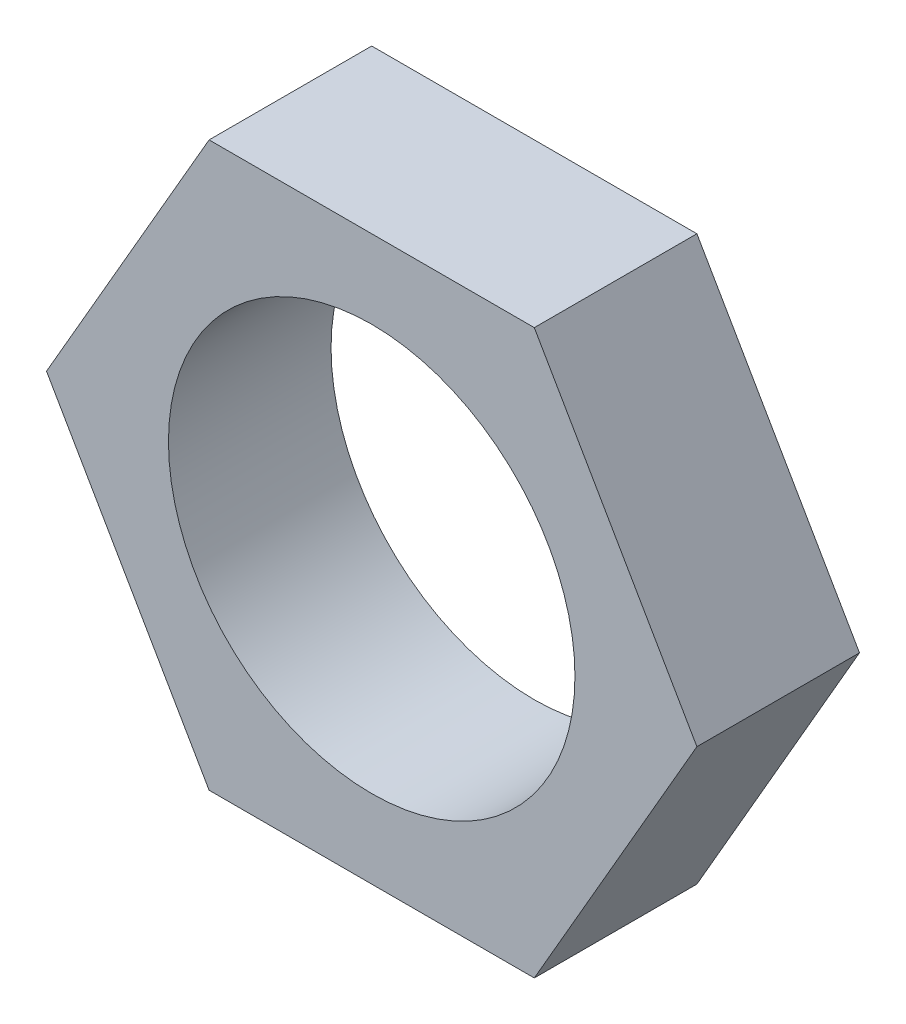
ISO-10303-21;
HEADER;
FILE_DESCRIPTION(('STEP AP214'),'2;1');
FILE_NAME('part.step','',(''),(''),'','','');
FILE_SCHEMA(('AUTOMOTIVE_DESIGN { 1 0 10303 214 1 1 1 1 }'));
ENDSEC;
DATA;
#1=APPLICATION_CONTEXT('core data for automotive mechanical design processes');
#2=APPLICATION_PROTOCOL_DEFINITION('international standard','automotive_design',2000,#1);
#3=PRODUCT_CONTEXT('',#1,'mechanical');
#4=PRODUCT('Part','Part','',(#3));
#5=PRODUCT_RELATED_PRODUCT_CATEGORY('part','',(#4));
#6=PRODUCT_DEFINITION_FORMATION('','',#4);
#7=PRODUCT_DEFINITION_CONTEXT('part definition',#1,'design');
#8=PRODUCT_DEFINITION('design','',#6,#7);
#9=PRODUCT_DEFINITION_SHAPE('','',#8);
#10=(LENGTH_UNIT() NAMED_UNIT(*) SI_UNIT(.MILLI.,.METRE.));
#11=(NAMED_UNIT(*) PLANE_ANGLE_UNIT() SI_UNIT($,.RADIAN.));
#12=(NAMED_UNIT(*) SI_UNIT($,.STERADIAN.) SOLID_ANGLE_UNIT());
#13=UNCERTAINTY_MEASURE_WITH_UNIT(LENGTH_MEASURE(1.E-05),#10,'distance_accuracy_value','');
#14=(GEOMETRIC_REPRESENTATION_CONTEXT(3) GLOBAL_UNCERTAINTY_ASSIGNED_CONTEXT((#13)) GLOBAL_UNIT_ASSIGNED_CONTEXT((#10,
#11,#12)) REPRESENTATION_CONTEXT('',''));
#15=CARTESIAN_POINT('',(0.,0.,0.));
#16=DIRECTION('',(0.,0.,1.));
#17=DIRECTION('',(1.,0.,0.));
#18=AXIS2_PLACEMENT_3D('',#15,#16,#17);
#19=CARTESIAN_POINT('',(0.,0.,2.));
#20=DIRECTION('',(0.,0.,1.));
#21=DIRECTION('',(1.,0.,0.));
#22=AXIS2_PLACEMENT_3D('',#19,#20,#21);
#23=PLANE('',#22);
#24=DIRECTION('',(0.5,0.866025403784439,0.));
#25=VECTOR('',#24,1.);
#26=CARTESIAN_POINT('',(2.,-3.46410161513775,2.));
#27=LINE('',#26,#25);
#28=CARTESIAN_POINT('',(2.,-3.46410161513775,2.));
#29=VERTEX_POINT('',#28);
#30=CARTESIAN_POINT('',(4.,0.,2.));
#31=VERTEX_POINT('',#30);
#32=EDGE_CURVE('E135',#29,#31,#27,.T.);
#33=ORIENTED_EDGE('',*,*,#32,.T.);
#34=DIRECTION('',(-0.5,0.866025403784439,0.));
#35=VECTOR('',#34,1.);
#36=CARTESIAN_POINT('',(4.,0.,2.));
#37=LINE('',#36,#35);
#38=CARTESIAN_POINT('',(2.,3.46410161513775,2.));
#39=VERTEX_POINT('',#38);
#40=EDGE_CURVE('E93',#31,#39,#37,.T.);
#41=ORIENTED_EDGE('',*,*,#40,.T.);
#42=DIRECTION('',(-1.,0.,0.));
#43=VECTOR('',#42,1.);
#44=CARTESIAN_POINT('',(2.,3.46410161513775,2.));
#45=LINE('',#44,#43);
#46=CARTESIAN_POINT('',(-2.,3.46410161513775,2.));
#47=VERTEX_POINT('',#46);
#48=EDGE_CURVE('E106',#39,#47,#45,.T.);
#49=ORIENTED_EDGE('',*,*,#48,.T.);
#50=DIRECTION('',(-0.5,-0.866025403784439,0.));
#51=VECTOR('',#50,1.);
#52=CARTESIAN_POINT('',(-2.,3.46410161513775,2.));
#53=LINE('',#52,#51);
#54=CARTESIAN_POINT('',(-4.,0.,2.));
#55=VERTEX_POINT('',#54);
#56=EDGE_CURVE('E100',#47,#55,#53,.T.);
#57=ORIENTED_EDGE('',*,*,#56,.T.);
#58=DIRECTION('',(0.5,-0.866025403784439,0.));
#59=VECTOR('',#58,1.);
#60=CARTESIAN_POINT('',(-4.,0.,2.));
#61=LINE('',#60,#59);
#62=CARTESIAN_POINT('',(-2.,-3.46410161513775,2.));
#63=VERTEX_POINT('',#62);
#64=EDGE_CURVE('E104',#55,#63,#61,.T.);
#65=ORIENTED_EDGE('',*,*,#64,.T.);
#66=DIRECTION('',(1.,0.,0.));
#67=VECTOR('',#66,1.);
#68=CARTESIAN_POINT('',(-2.,-3.46410161513775,2.));
#69=LINE('',#68,#67);
#70=EDGE_CURVE('E56',#63,#29,#69,.T.);
#71=ORIENTED_EDGE('',*,*,#70,.T.);
#72=EDGE_LOOP('',(#33,#41,#49,#57,#65,#71));
#73=FACE_BOUND('',#72,.T.);
#74=CARTESIAN_POINT('',(0.,0.,2.));
#75=DIRECTION('',(0.,0.,1.));
#76=DIRECTION('',(1.,0.,0.));
#77=AXIS2_PLACEMENT_3D('',#74,#75,#76);
#78=CIRCLE('',#77,2.5);
#79=CARTESIAN_POINT('',(2.5,0.,2.));
#80=VERTEX_POINT('',#79);
#81=EDGE_CURVE('E128',#80,#80,#78,.T.);
#82=ORIENTED_EDGE('',*,*,#81,.F.);
#83=EDGE_LOOP('',(#82));
#84=FACE_BOUND('',#83,.T.);
#85=ADVANCED_FACE('F39',(#73,#84),#23,.T.);
#86=CARTESIAN_POINT('',(0.,0.,0.));
#87=DIRECTION('',(0.,0.,1.));
#88=DIRECTION('',(1.,0.,0.));
#89=AXIS2_PLACEMENT_3D('',#86,#87,#88);
#90=PLANE('',#89);
#91=DIRECTION('',(0.5,0.866025403784439,0.));
#92=VECTOR('',#91,1.);
#93=CARTESIAN_POINT('',(2.,-3.46410161513775,0.));
#94=LINE('',#93,#92);
#95=CARTESIAN_POINT('',(2.,-3.46410161513775,0.));
#96=VERTEX_POINT('',#95);
#97=CARTESIAN_POINT('',(4.,0.,0.));
#98=VERTEX_POINT('',#97);
#99=EDGE_CURVE('E124',#96,#98,#94,.T.);
#100=ORIENTED_EDGE('',*,*,#99,.F.);
#101=DIRECTION('',(1.,0.,0.));
#102=VECTOR('',#101,1.);
#103=CARTESIAN_POINT('',(-2.,-3.46410161513775,0.));
#104=LINE('',#103,#102);
#105=CARTESIAN_POINT('',(-2.,-3.46410161513775,0.));
#106=VERTEX_POINT('',#105);
#107=EDGE_CURVE('E85',#106,#96,#104,.T.);
#108=ORIENTED_EDGE('',*,*,#107,.F.);
#109=DIRECTION('',(0.5,-0.866025403784439,0.));
#110=VECTOR('',#109,1.);
#111=CARTESIAN_POINT('',(-4.,0.,0.));
#112=LINE('',#111,#110);
#113=CARTESIAN_POINT('',(-4.,0.,0.));
#114=VERTEX_POINT('',#113);
#115=EDGE_CURVE('E79',#114,#106,#112,.T.);
#116=ORIENTED_EDGE('',*,*,#115,.F.);
#117=DIRECTION('',(-0.5,-0.866025403784439,0.));
#118=VECTOR('',#117,1.);
#119=CARTESIAN_POINT('',(-2.,3.46410161513775,0.));
#120=LINE('',#119,#118);
#121=CARTESIAN_POINT('',(-2.,3.46410161513775,0.));
#122=VERTEX_POINT('',#121);
#123=EDGE_CURVE('E114',#122,#114,#120,.T.);
#124=ORIENTED_EDGE('',*,*,#123,.F.);
#125=DIRECTION('',(-1.,0.,0.));
#126=VECTOR('',#125,1.);
#127=CARTESIAN_POINT('',(2.,3.46410161513775,0.));
#128=LINE('',#127,#126);
#129=CARTESIAN_POINT('',(2.,3.46410161513775,0.));
#130=VERTEX_POINT('',#129);
#131=EDGE_CURVE('E130',#130,#122,#128,.T.);
#132=ORIENTED_EDGE('',*,*,#131,.F.);
#133=DIRECTION('',(-0.5,0.866025403784439,0.));
#134=VECTOR('',#133,1.);
#135=CARTESIAN_POINT('',(4.,0.,0.));
#136=LINE('',#135,#134);
#137=EDGE_CURVE('E127',#98,#130,#136,.T.);
#138=ORIENTED_EDGE('',*,*,#137,.F.);
#139=EDGE_LOOP('',(#100,#108,#116,#124,#132,#138));
#140=FACE_BOUND('',#139,.T.);
#141=CARTESIAN_POINT('',(0.,0.,0.));
#142=DIRECTION('',(0.,0.,1.));
#143=DIRECTION('',(1.,0.,0.));
#144=AXIS2_PLACEMENT_3D('',#141,#142,#143);
#145=CIRCLE('',#144,2.5);
#146=CARTESIAN_POINT('',(2.5,0.,0.));
#147=VERTEX_POINT('',#146);
#148=EDGE_CURVE('E230',#147,#147,#145,.T.);
#149=ORIENTED_EDGE('',*,*,#148,.T.);
#150=EDGE_LOOP('',(#149));
#151=FACE_BOUND('',#150,.T.);
#152=ADVANCED_FACE('F144',(#140,#151),#90,.F.);
#153=CARTESIAN_POINT('',(2.,-3.46410161513775,2.));
#154=DIRECTION('',(-0.866025403784439,0.5,0.));
#155=DIRECTION('',(-0.5,-0.866025403784439,0.));
#156=AXIS2_PLACEMENT_3D('',#153,#154,#155);
#157=PLANE('',#156);
#158=ORIENTED_EDGE('',*,*,#99,.T.);
#159=DIRECTION('',(0.,0.,-1.));
#160=VECTOR('',#159,1.);
#161=CARTESIAN_POINT('',(4.,0.,2.));
#162=LINE('',#161,#160);
#163=EDGE_CURVE('E11',#31,#98,#162,.T.);
#164=ORIENTED_EDGE('',*,*,#163,.F.);
#165=ORIENTED_EDGE('',*,*,#32,.F.);
#166=DIRECTION('',(0.,0.,-1.));
#167=VECTOR('',#166,1.);
#168=CARTESIAN_POINT('',(2.,-3.46410161513775,2.));
#169=LINE('',#168,#167);
#170=EDGE_CURVE('E120',#29,#96,#169,.T.);
#171=ORIENTED_EDGE('',*,*,#170,.T.);
#172=EDGE_LOOP('',(#158,#164,#165,#171));
#173=FACE_BOUND('',#172,.T.);
#174=ADVANCED_FACE('F41',(#173),#157,.F.);
#175=CARTESIAN_POINT('',(4.,0.,2.));
#176=DIRECTION('',(-0.866025403784439,-0.5,0.));
#177=DIRECTION('',(0.5,-0.866025403784439,0.));
#178=AXIS2_PLACEMENT_3D('',#175,#176,#177);
#179=PLANE('',#178);
#180=ORIENTED_EDGE('',*,*,#137,.T.);
#181=DIRECTION('',(0.,0.,-1.));
#182=VECTOR('',#181,1.);
#183=CARTESIAN_POINT('',(2.,3.46410161513775,2.));
#184=LINE('',#183,#182);
#185=EDGE_CURVE('E48',#39,#130,#184,.T.);
#186=ORIENTED_EDGE('',*,*,#185,.F.);
#187=ORIENTED_EDGE('',*,*,#40,.F.);
#188=ORIENTED_EDGE('',*,*,#163,.T.);
#189=EDGE_LOOP('',(#180,#186,#187,#188));
#190=FACE_BOUND('',#189,.T.);
#191=ADVANCED_FACE('F169',(#190),#179,.F.);
#192=CARTESIAN_POINT('',(2.,3.46410161513775,2.));
#193=DIRECTION('',(0.,-1.,0.));
#194=DIRECTION('',(1.,0.,0.));
#195=AXIS2_PLACEMENT_3D('',#192,#193,#194);
#196=PLANE('',#195);
#197=ORIENTED_EDGE('',*,*,#131,.T.);
#198=DIRECTION('',(0.,0.,-1.));
#199=VECTOR('',#198,1.);
#200=CARTESIAN_POINT('',(-2.,3.46410161513775,2.));
#201=LINE('',#200,#199);
#202=EDGE_CURVE('E115',#47,#122,#201,.T.);
#203=ORIENTED_EDGE('',*,*,#202,.F.);
#204=ORIENTED_EDGE('',*,*,#48,.F.);
#205=ORIENTED_EDGE('',*,*,#185,.T.);
#206=EDGE_LOOP('',(#197,#203,#204,#205));
#207=FACE_BOUND('',#206,.T.);
#208=ADVANCED_FACE('F141',(#207),#196,.F.);
#209=CARTESIAN_POINT('',(-2.,3.46410161513775,2.));
#210=DIRECTION('',(0.866025403784439,-0.5,0.));
#211=DIRECTION('',(0.5,0.866025403784439,0.));
#212=AXIS2_PLACEMENT_3D('',#209,#210,#211);
#213=PLANE('',#212);
#214=ORIENTED_EDGE('',*,*,#123,.T.);
#215=DIRECTION('',(0.,0.,-1.));
#216=VECTOR('',#215,1.);
#217=CARTESIAN_POINT('',(-4.,0.,2.));
#218=LINE('',#217,#216);
#219=EDGE_CURVE('E111',#55,#114,#218,.T.);
#220=ORIENTED_EDGE('',*,*,#219,.F.);
#221=ORIENTED_EDGE('',*,*,#56,.F.);
#222=ORIENTED_EDGE('',*,*,#202,.T.);
#223=EDGE_LOOP('',(#214,#220,#221,#222));
#224=FACE_BOUND('',#223,.T.);
#225=ADVANCED_FACE('F112',(#224),#213,.F.);
#226=CARTESIAN_POINT('',(-4.,0.,2.));
#227=DIRECTION('',(0.866025403784439,0.5,0.));
#228=DIRECTION('',(-0.5,0.866025403784439,0.));
#229=AXIS2_PLACEMENT_3D('',#226,#227,#228);
#230=PLANE('',#229);
#231=ORIENTED_EDGE('',*,*,#115,.T.);
#232=DIRECTION('',(0.,0.,-1.));
#233=VECTOR('',#232,1.);
#234=CARTESIAN_POINT('',(-2.,-3.46410161513775,2.));
#235=LINE('',#234,#233);
#236=EDGE_CURVE('E116',#63,#106,#235,.T.);
#237=ORIENTED_EDGE('',*,*,#236,.F.);
#238=ORIENTED_EDGE('',*,*,#64,.F.);
#239=ORIENTED_EDGE('',*,*,#219,.T.);
#240=EDGE_LOOP('',(#231,#237,#238,#239));
#241=FACE_BOUND('',#240,.T.);
#242=ADVANCED_FACE('F118',(#241),#230,.F.);
#243=CARTESIAN_POINT('',(-2.,-3.46410161513775,2.));
#244=DIRECTION('',(0.,1.,0.));
#245=DIRECTION('',(-1.,0.,0.));
#246=AXIS2_PLACEMENT_3D('',#243,#244,#245);
#247=PLANE('',#246);
#248=ORIENTED_EDGE('',*,*,#107,.T.);
#249=ORIENTED_EDGE('',*,*,#170,.F.);
#250=ORIENTED_EDGE('',*,*,#70,.F.);
#251=ORIENTED_EDGE('',*,*,#236,.T.);
#252=EDGE_LOOP('',(#248,#249,#250,#251));
#253=FACE_BOUND('',#252,.T.);
#254=ADVANCED_FACE('F149',(#253),#247,.F.);
#255=CARTESIAN_POINT('',(0.,0.,2.));
#256=DIRECTION('',(0.,0.,-1.));
#257=DIRECTION('',(-1.,0.,0.));
#258=AXIS2_PLACEMENT_3D('',#255,#256,#257);
#259=CYLINDRICAL_SURFACE('',#258,2.5);
#260=ORIENTED_EDGE('',*,*,#81,.T.);
#261=EDGE_LOOP('',(#260));
#262=FACE_BOUND('',#261,.T.);
#263=ORIENTED_EDGE('',*,*,#148,.F.);
#264=EDGE_LOOP('',(#263));
#265=FACE_BOUND('',#264,.T.);
#266=ADVANCED_FACE('F151',(#262,#265),#259,.F.);
#267=CLOSED_SHELL('',(#85,#152,#174,#191,#208,#225,#242,#254,#266));
#268=MANIFOLD_SOLID_BREP('B2',#267);
#269=ADVANCED_BREP_SHAPE_REPRESENTATION('',(#18,#268),#14);
#270=SHAPE_DEFINITION_REPRESENTATION(#9,#269);
ENDSEC;
END-ISO-10303-21;
